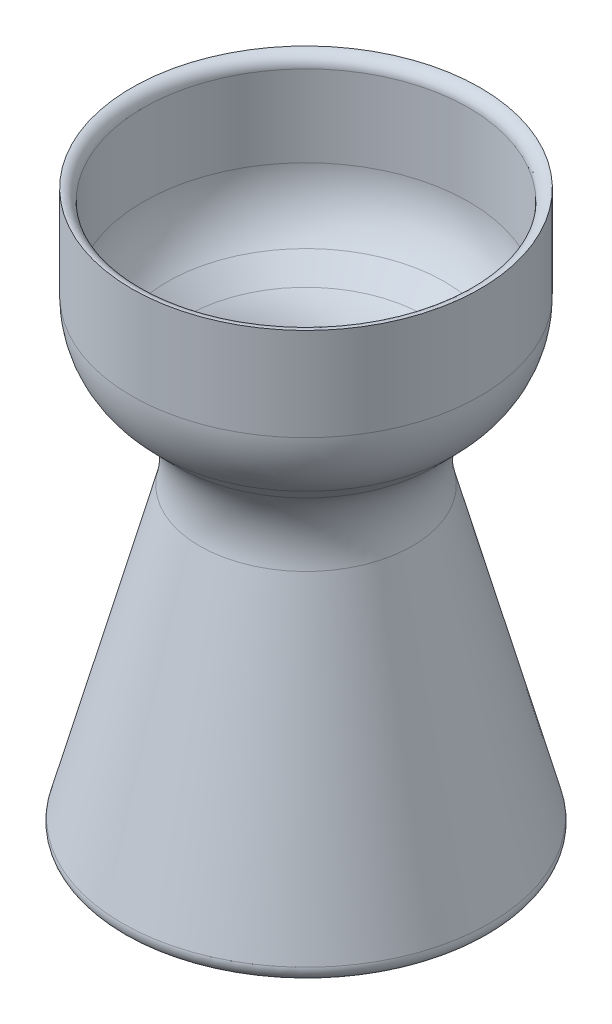
ISO-10303-21;
HEADER;
FILE_DESCRIPTION(('STEP AP214'),'2;1');
FILE_NAME('part.step','',(''),(''),'','','');
FILE_SCHEMA(('AUTOMOTIVE_DESIGN { 1 0 10303 214 1 1 1 1 }'));
ENDSEC;
DATA;
#1=APPLICATION_CONTEXT('core data for automotive mechanical design processes');
#2=APPLICATION_PROTOCOL_DEFINITION('international standard','automotive_design',2000,#1);
#3=PRODUCT_CONTEXT('',#1,'mechanical');
#4=PRODUCT('Part','Part','',(#3));
#5=PRODUCT_RELATED_PRODUCT_CATEGORY('part','',(#4));
#6=PRODUCT_DEFINITION_FORMATION('','',#4);
#7=PRODUCT_DEFINITION_CONTEXT('part definition',#1,'design');
#8=PRODUCT_DEFINITION('design','',#6,#7);
#9=PRODUCT_DEFINITION_SHAPE('','',#8);
#10=(LENGTH_UNIT() NAMED_UNIT(*) SI_UNIT(.MILLI.,.METRE.));
#11=(NAMED_UNIT(*) PLANE_ANGLE_UNIT() SI_UNIT($,.RADIAN.));
#12=(NAMED_UNIT(*) SI_UNIT($,.STERADIAN.) SOLID_ANGLE_UNIT());
#13=UNCERTAINTY_MEASURE_WITH_UNIT(LENGTH_MEASURE(1.E-05),#10,'distance_accuracy_value','');
#14=(GEOMETRIC_REPRESENTATION_CONTEXT(3) GLOBAL_UNCERTAINTY_ASSIGNED_CONTEXT((#13)) GLOBAL_UNIT_ASSIGNED_CONTEXT((#10,
#11,#12)) REPRESENTATION_CONTEXT('',''));
#15=CARTESIAN_POINT('',(0.,0.,0.));
#16=DIRECTION('',(0.,0.,1.));
#17=DIRECTION('',(1.,0.,0.));
#18=AXIS2_PLACEMENT_3D('',#15,#16,#17);
#19=CARTESIAN_POINT('',(0.,3.06681449846779,0.));
#20=DIRECTION('',(0.,-1.,0.));
#21=DIRECTION('',(0.,0.,-1.));
#22=AXIS2_PLACEMENT_3D('',#19,#20,#21);
#23=TOROIDAL_SURFACE('',#22,47.1080495317995,3.17500000000001);
#24=CARTESIAN_POINT('',(0.,3.8885649666683,0.));
#25=DIRECTION('',(0.,-1.,0.));
#26=DIRECTION('',(0.,0.,-1.));
#27=AXIS2_PLACEMENT_3D('',#24,#25,#26);
#28=CIRCLE('',#27,50.1748640302673);
#29=CARTESIAN_POINT('',(0.,3.8885649666683,-50.1748640302673));
#30=VERTEX_POINT('',#29);
#31=EDGE_CURVE('E71',#30,#30,#28,.T.);
#32=ORIENTED_EDGE('',*,*,#31,.T.);
#33=EDGE_LOOP('',(#32));
#34=FACE_BOUND('',#33,.T.);
#35=CARTESIAN_POINT('',(0.,0.,0.));
#36=DIRECTION('',(0.,-1.,0.));
#37=DIRECTION('',(0.,0.,-1.));
#38=AXIS2_PLACEMENT_3D('',#35,#36,#37);
#39=CIRCLE('',#38,47.9298);
#40=CARTESIAN_POINT('',(0.,0.,-47.9298));
#41=VERTEX_POINT('',#40);
#42=EDGE_CURVE('E10',#41,#41,#39,.T.);
#43=ORIENTED_EDGE('',*,*,#42,.F.);
#44=EDGE_LOOP('',(#43));
#45=FACE_BOUND('',#44,.T.);
#46=ADVANCED_FACE('F31',(#34,#45),#23,.T.);
#47=CARTESIAN_POINT('',(0.,81.8476659278595,0.));
#48=DIRECTION('',(0.,-1.,0.));
#49=DIRECTION('',(0.,0.,-1.));
#50=AXIS2_PLACEMENT_3D('',#47,#48,#49);
#51=CONICAL_SURFACE('',#50,25.9987840122577,0.26179938779915);
#52=ORIENTED_EDGE('',*,*,#42,.T.);
#53=EDGE_LOOP('',(#52));
#54=FACE_BOUND('',#53,.T.);
#55=CARTESIAN_POINT('',(0.,81.8476659278595,0.));
#56=DIRECTION('',(0.,-1.,0.));
#57=DIRECTION('',(0.,0.,-1.));
#58=AXIS2_PLACEMENT_3D('',#55,#56,#57);
#59=CIRCLE('',#58,25.9987840122577);
#60=CARTESIAN_POINT('',(0.,81.8476659278595,-25.9987840122577));
#61=VERTEX_POINT('',#60);
#62=EDGE_CURVE('E37',#61,#61,#59,.T.);
#63=ORIENTED_EDGE('',*,*,#62,.F.);
#64=EDGE_LOOP('',(#63));
#65=FACE_BOUND('',#64,.T.);
#66=ADVANCED_FACE('F89',(#54,#65),#51,.F.);
#67=CARTESIAN_POINT('',(0.,88.4216696734635,0.));
#68=DIRECTION('',(0.,-1.,0.));
#69=DIRECTION('',(0.,0.,-1.));
#70=AXIS2_PLACEMENT_3D('',#67,#68,#69);
#71=TOROIDAL_SURFACE('',#70,50.5333,25.4);
#72=ORIENTED_EDGE('',*,*,#62,.T.);
#73=EDGE_LOOP('',(#72));
#74=FACE_BOUND('',#73,.T.);
#75=CARTESIAN_POINT('',(0.,106.382181915602,0.));
#76=DIRECTION('',(0.,-1.,0.));
#77=DIRECTION('',(0.,0.,-1.));
#78=AXIS2_PLACEMENT_3D('',#75,#76,#77);
#79=CIRCLE('',#78,32.5727877578617);
#80=CARTESIAN_POINT('',(0.,106.382181915602,-32.5727877578617));
#81=VERTEX_POINT('',#80);
#82=EDGE_CURVE('E41',#81,#81,#79,.T.);
#83=ORIENTED_EDGE('',*,*,#82,.F.);
#84=EDGE_LOOP('',(#83));
#85=FACE_BOUND('',#84,.T.);
#86=ADVANCED_FACE('F93',(#74,#85),#71,.T.);
#87=CARTESIAN_POINT('',(0.,111.749842369611,0.));
#88=DIRECTION('',(0.,1.,0.));
#89=DIRECTION('',(0.,0.,1.));
#90=AXIS2_PLACEMENT_3D('',#87,#88,#89);
#91=CONICAL_SURFACE('',#90,37.9404482118708,0.785398163397455);
#92=ORIENTED_EDGE('',*,*,#82,.T.);
#93=EDGE_LOOP('',(#92));
#94=FACE_BOUND('',#93,.T.);
#95=CARTESIAN_POINT('',(0.,111.749842369611,0.));
#96=DIRECTION('',(0.,-1.,0.));
#97=DIRECTION('',(0.,0.,-1.));
#98=AXIS2_PLACEMENT_3D('',#95,#96,#97);
#99=CIRCLE('',#98,37.9404482118708);
#100=CARTESIAN_POINT('',(0.,111.749842369611,-37.9404482118708));
#101=VERTEX_POINT('',#100);
#102=EDGE_CURVE('E45',#101,#101,#99,.T.);
#103=ORIENTED_EDGE('',*,*,#102,.F.);
#104=EDGE_LOOP('',(#103));
#105=FACE_BOUND('',#104,.T.);
#106=ADVANCED_FACE('F97',(#94,#105),#91,.F.);
#107=CARTESIAN_POINT('',(0.,127.465290581482,0.));
#108=DIRECTION('',(0.,-1.,0.));
#109=DIRECTION('',(0.,0.,-1.));
#110=AXIS2_PLACEMENT_3D('',#107,#108,#109);
#111=TOROIDAL_SURFACE('',#110,22.225,22.2249999999997);
#112=ORIENTED_EDGE('',*,*,#102,.T.);
#113=EDGE_LOOP('',(#112));
#114=FACE_BOUND('',#113,.T.);
#115=CARTESIAN_POINT('',(0.,127.465290581482,0.));
#116=DIRECTION('',(0.,-1.,0.));
#117=DIRECTION('',(0.,0.,-1.));
#118=AXIS2_PLACEMENT_3D('',#115,#116,#117);
#119=CIRCLE('',#118,44.4499999999997);
#120=CARTESIAN_POINT('',(0.,127.465290581482,-44.4499999999997));
#121=VERTEX_POINT('',#120);
#122=EDGE_CURVE('E50',#121,#121,#119,.T.);
#123=ORIENTED_EDGE('',*,*,#122,.F.);
#124=EDGE_LOOP('',(#123));
#125=FACE_BOUND('',#124,.T.);
#126=ADVANCED_FACE('F103',(#114,#125),#111,.F.);
#127=CARTESIAN_POINT('',(0.,0.,0.));
#128=DIRECTION('',(0.,-1.,0.));
#129=DIRECTION('',(0.,0.,-1.));
#130=AXIS2_PLACEMENT_3D('',#127,#128,#129);
#131=CYLINDRICAL_SURFACE('',#130,44.4499999999997);
#132=ORIENTED_EDGE('',*,*,#122,.T.);
#133=EDGE_LOOP('',(#132));
#134=FACE_BOUND('',#133,.T.);
#135=CARTESIAN_POINT('',(0.,149.690290581481,0.));
#136=DIRECTION('',(0.,-1.,0.));
#137=DIRECTION('',(0.,0.,-1.));
#138=AXIS2_PLACEMENT_3D('',#135,#136,#137);
#139=CIRCLE('',#138,44.4499999999997);
#140=CARTESIAN_POINT('',(0.,149.690290581481,-44.4499999999997));
#141=VERTEX_POINT('',#140);
#142=EDGE_CURVE('E53',#141,#141,#139,.T.);
#143=ORIENTED_EDGE('',*,*,#142,.F.);
#144=EDGE_LOOP('',(#143));
#145=FACE_BOUND('',#144,.T.);
#146=ADVANCED_FACE('F107',(#134,#145),#131,.F.);
#147=CARTESIAN_POINT('',(0.,149.690290581481,0.));
#148=DIRECTION('',(0.,-1.,0.));
#149=DIRECTION('',(0.,0.,-1.));
#150=AXIS2_PLACEMENT_3D('',#147,#148,#149);
#151=TOROIDAL_SURFACE('',#150,47.625,3.17500000000034);
#152=ORIENTED_EDGE('',*,*,#142,.T.);
#153=EDGE_LOOP('',(#152));
#154=FACE_BOUND('',#153,.T.);
#155=CARTESIAN_POINT('',(0.,152.865290581482,0.));
#156=DIRECTION('',(0.,-1.,0.));
#157=DIRECTION('',(0.,0.,-1.));
#158=AXIS2_PLACEMENT_3D('',#155,#156,#157);
#159=CIRCLE('',#158,47.625);
#160=CARTESIAN_POINT('',(0.,152.865290581482,-47.625));
#161=VERTEX_POINT('',#160);
#162=EDGE_CURVE('E56',#161,#161,#159,.T.);
#163=ORIENTED_EDGE('',*,*,#162,.F.);
#164=EDGE_LOOP('',(#163));
#165=FACE_BOUND('',#164,.T.);
#166=ADVANCED_FACE('F111',(#154,#165),#151,.T.);
#167=CARTESIAN_POINT('',(0.,0.,0.));
#168=DIRECTION('',(0.,-1.,0.));
#169=DIRECTION('',(0.,0.,-1.));
#170=AXIS2_PLACEMENT_3D('',#167,#168,#169);
#171=CYLINDRICAL_SURFACE('',#170,47.625);
#172=ORIENTED_EDGE('',*,*,#162,.T.);
#173=EDGE_LOOP('',(#172));
#174=FACE_BOUND('',#173,.T.);
#175=CARTESIAN_POINT('',(0.,127.465290581482,0.));
#176=DIRECTION('',(0.,-1.,0.));
#177=DIRECTION('',(0.,0.,-1.));
#178=AXIS2_PLACEMENT_3D('',#175,#176,#177);
#179=CIRCLE('',#178,47.625);
#180=CARTESIAN_POINT('',(0.,127.465290581482,-47.625));
#181=VERTEX_POINT('',#180);
#182=EDGE_CURVE('E59',#181,#181,#179,.T.);
#183=ORIENTED_EDGE('',*,*,#182,.F.);
#184=EDGE_LOOP('',(#183));
#185=FACE_BOUND('',#184,.T.);
#186=ADVANCED_FACE('F115',(#174,#185),#171,.T.);
#187=CARTESIAN_POINT('',(0.,127.465290581482,0.));
#188=DIRECTION('',(0.,-1.,0.));
#189=DIRECTION('',(0.,0.,-1.));
#190=AXIS2_PLACEMENT_3D('',#187,#188,#189);
#191=DEGENERATE_TOROIDAL_SURFACE('',#190,22.225,25.4,.T.);
#192=ORIENTED_EDGE('',*,*,#182,.T.);
#193=EDGE_LOOP('',(#192));
#194=FACE_BOUND('',#193,.T.);
#195=CARTESIAN_POINT('',(0.,109.504778339343,0.));
#196=DIRECTION('',(0.,-1.,0.));
#197=DIRECTION('',(0.,0.,-1.));
#198=AXIS2_PLACEMENT_3D('',#195,#196,#197);
#199=CIRCLE('',#198,40.1855122421383);
#200=CARTESIAN_POINT('',(0.,109.504778339343,-40.1855122421383));
#201=VERTEX_POINT('',#200);
#202=EDGE_CURVE('E62',#201,#201,#199,.T.);
#203=ORIENTED_EDGE('',*,*,#202,.F.);
#204=EDGE_LOOP('',(#203));
#205=FACE_BOUND('',#204,.T.);
#206=ADVANCED_FACE('F119',(#194,#205),#191,.T.);
#207=CARTESIAN_POINT('',(0.,104.137117885334,0.));
#208=DIRECTION('',(0.,1.,0.));
#209=DIRECTION('',(0.,0.,1.));
#210=AXIS2_PLACEMENT_3D('',#207,#208,#209);
#211=CONICAL_SURFACE('',#210,34.8178517881292,0.785398163397451);
#212=ORIENTED_EDGE('',*,*,#202,.T.);
#213=EDGE_LOOP('',(#212));
#214=FACE_BOUND('',#213,.T.);
#215=CARTESIAN_POINT('',(0.,104.137117885334,0.));
#216=DIRECTION('',(0.,-1.,0.));
#217=DIRECTION('',(0.,0.,-1.));
#218=AXIS2_PLACEMENT_3D('',#215,#216,#217);
#219=CIRCLE('',#218,34.8178517881292);
#220=CARTESIAN_POINT('',(0.,104.137117885334,-34.8178517881292));
#221=VERTEX_POINT('',#220);
#222=EDGE_CURVE('E65',#221,#221,#219,.T.);
#223=ORIENTED_EDGE('',*,*,#222,.F.);
#224=EDGE_LOOP('',(#223));
#225=FACE_BOUND('',#224,.T.);
#226=ADVANCED_FACE('F85',(#214,#225),#211,.T.);
#227=CARTESIAN_POINT('',(0.,88.4216696734635,0.));
#228=DIRECTION('',(0.,-1.,0.));
#229=DIRECTION('',(0.,0.,-1.));
#230=AXIS2_PLACEMENT_3D('',#227,#228,#229);
#231=TOROIDAL_SURFACE('',#230,50.5333,22.2249999999998);
#232=ORIENTED_EDGE('',*,*,#222,.T.);
#233=EDGE_LOOP('',(#232));
#234=FACE_BOUND('',#233,.T.);
#235=CARTESIAN_POINT('',(0.,82.66941639606,0.));
#236=DIRECTION('',(0.,-1.,0.));
#237=DIRECTION('',(0.,0.,-1.));
#238=AXIS2_PLACEMENT_3D('',#235,#236,#237);
#239=CIRCLE('',#238,29.0655985107256);
#240=CARTESIAN_POINT('',(0.,82.66941639606,-29.0655985107256));
#241=VERTEX_POINT('',#240);
#242=EDGE_CURVE('E68',#241,#241,#239,.T.);
#243=ORIENTED_EDGE('',*,*,#242,.F.);
#244=EDGE_LOOP('',(#243));
#245=FACE_BOUND('',#244,.T.);
#246=ADVANCED_FACE('F79',(#234,#245),#231,.F.);
#247=CARTESIAN_POINT('',(0.,3.8885649666683,0.));
#248=DIRECTION('',(0.,-1.,0.));
#249=DIRECTION('',(0.,0.,-1.));
#250=AXIS2_PLACEMENT_3D('',#247,#248,#249);
#251=CONICAL_SURFACE('',#250,50.1748640302673,0.261799387799148);
#252=ORIENTED_EDGE('',*,*,#242,.T.);
#253=EDGE_LOOP('',(#252));
#254=FACE_BOUND('',#253,.T.);
#255=ORIENTED_EDGE('',*,*,#31,.F.);
#256=EDGE_LOOP('',(#255));
#257=FACE_BOUND('',#256,.T.);
#258=ADVANCED_FACE('F77',(#254,#257),#251,.T.);
#259=CLOSED_SHELL('',(#46,#66,#86,#106,#126,#146,#166,#186,#206,#226,#246,#258));
#260=MANIFOLD_SOLID_BREP('B2',#259);
#261=ADVANCED_BREP_SHAPE_REPRESENTATION('',(#18,#260),#14);
#262=SHAPE_DEFINITION_REPRESENTATION(#9,#261);
ENDSEC;
END-ISO-10303-21;
